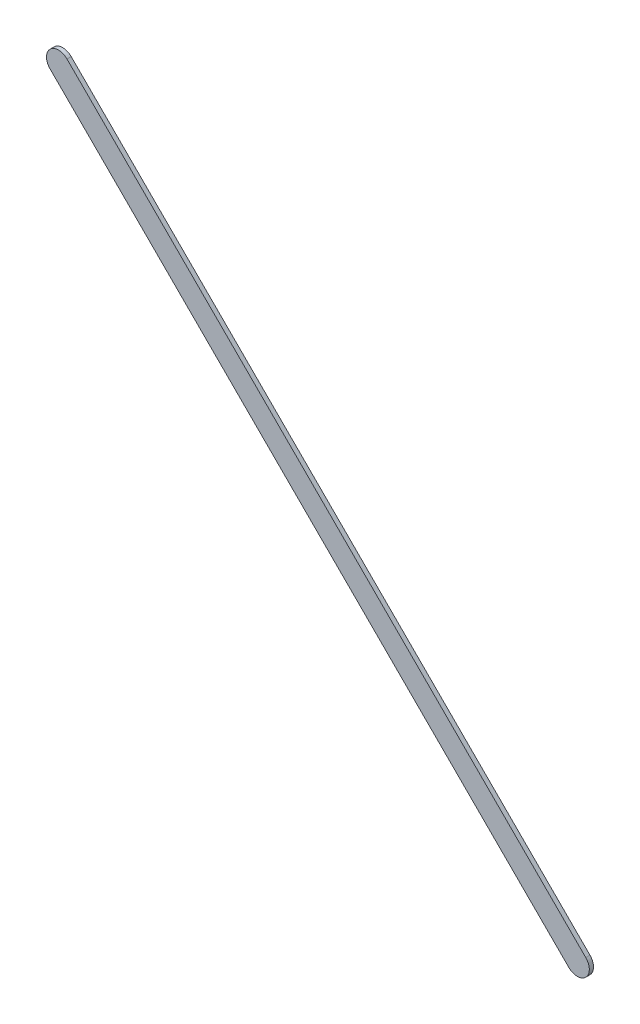
ISO-10303-21;
HEADER;
FILE_DESCRIPTION(('STEP AP214'),'2;1');
FILE_NAME('part.step','',(''),(''),'','','');
FILE_SCHEMA(('AUTOMOTIVE_DESIGN { 1 0 10303 214 1 1 1 1 }'));
ENDSEC;
DATA;
#1=APPLICATION_CONTEXT('core data for automotive mechanical design processes');
#2=APPLICATION_PROTOCOL_DEFINITION('international standard','automotive_design',2000,#1);
#3=PRODUCT_CONTEXT('',#1,'mechanical');
#4=PRODUCT('Part','Part','',(#3));
#5=PRODUCT_RELATED_PRODUCT_CATEGORY('part','',(#4));
#6=PRODUCT_DEFINITION_FORMATION('','',#4);
#7=PRODUCT_DEFINITION_CONTEXT('part definition',#1,'design');
#8=PRODUCT_DEFINITION('design','',#6,#7);
#9=PRODUCT_DEFINITION_SHAPE('','',#8);
#10=(LENGTH_UNIT() NAMED_UNIT(*) SI_UNIT(.MILLI.,.METRE.));
#11=(NAMED_UNIT(*) PLANE_ANGLE_UNIT() SI_UNIT($,.RADIAN.));
#12=(NAMED_UNIT(*) SI_UNIT($,.STERADIAN.) SOLID_ANGLE_UNIT());
#13=UNCERTAINTY_MEASURE_WITH_UNIT(LENGTH_MEASURE(1.E-05),#10,'distance_accuracy_value','');
#14=(GEOMETRIC_REPRESENTATION_CONTEXT(3) GLOBAL_UNCERTAINTY_ASSIGNED_CONTEXT((#13)) GLOBAL_UNIT_ASSIGNED_CONTEXT((#10,
#11,#12)) REPRESENTATION_CONTEXT('',''));
#15=CARTESIAN_POINT('',(0.,0.,0.));
#16=DIRECTION('',(0.,0.,1.));
#17=DIRECTION('',(1.,0.,0.));
#18=AXIS2_PLACEMENT_3D('',#15,#16,#17);
#19=CARTESIAN_POINT('',(85.104289,-119.173652,1.635));
#20=DIRECTION('',(0.,0.,1.));
#21=DIRECTION('',(1.,0.,0.));
#22=AXIS2_PLACEMENT_3D('',#19,#20,#21);
#23=PLANE('',#22);
#24=DIRECTION('',(0.707106781186548,-0.707106781186548,0.));
#25=VECTOR('',#24,1.);
#26=CARTESIAN_POINT('',(85.104289,-119.173652,1.635));
#27=LINE('',#26,#25);
#28=CARTESIAN_POINT('',(85.104289,-119.173652,1.635));
#29=VERTEX_POINT('',#28);
#30=CARTESIAN_POINT('',(89.426347,-123.49571,1.635));
#31=VERTEX_POINT('',#30);
#32=EDGE_CURVE('E96',#29,#31,#27,.T.);
#33=ORIENTED_EDGE('',*,*,#32,.T.);
#34=CARTESIAN_POINT('',(89.4970575,-123.4249995,1.635));
#35=DIRECTION('',(0.,0.,1.));
#36=DIRECTION('',(-0.707106781186548,-0.707106781186548,0.));
#37=AXIS2_PLACEMENT_3D('',#34,#35,#36);
#38=CIRCLE('',#37,0.09999974810218);
#39=CARTESIAN_POINT('',(89.567768,-123.354289,1.635));
#40=VERTEX_POINT('',#39);
#41=EDGE_CURVE('E76',#31,#40,#38,.T.);
#42=ORIENTED_EDGE('',*,*,#41,.T.);
#43=DIRECTION('',(-0.707106781186548,0.707106781186548,0.));
#44=VECTOR('',#43,1.);
#45=CARTESIAN_POINT('',(89.567768,-123.354289,1.635));
#46=LINE('',#45,#44);
#47=CARTESIAN_POINT('',(85.24571,-119.032231,1.635));
#48=VERTEX_POINT('',#47);
#49=EDGE_CURVE('E80',#40,#48,#46,.T.);
#50=ORIENTED_EDGE('',*,*,#49,.T.);
#51=CARTESIAN_POINT('',(85.1749995,-119.1029415,1.635));
#52=DIRECTION('',(0.,0.,1.));
#53=DIRECTION('',(0.707106781186548,0.707106781186548,0.));
#54=AXIS2_PLACEMENT_3D('',#51,#52,#53);
#55=CIRCLE('',#54,0.09999974810219);
#56=EDGE_CURVE('E11',#48,#29,#55,.T.);
#57=ORIENTED_EDGE('',*,*,#56,.T.);
#58=EDGE_LOOP('',(#33,#42,#50,#57));
#59=FACE_BOUND('',#58,.T.);
#60=ADVANCED_FACE('F17',(#59),#23,.T.);
#61=CARTESIAN_POINT('',(85.104289,-119.173652,1.6));
#62=DIRECTION('',(0.,0.,1.));
#63=DIRECTION('',(1.,0.,0.));
#64=AXIS2_PLACEMENT_3D('',#61,#62,#63);
#65=PLANE('',#64);
#66=CARTESIAN_POINT('',(85.1749995,-119.1029415,1.6));
#67=DIRECTION('',(0.,0.,1.));
#68=DIRECTION('',(0.707106781186548,0.707106781186548,0.));
#69=AXIS2_PLACEMENT_3D('',#66,#67,#68);
#70=CIRCLE('',#69,0.09999974810219);
#71=CARTESIAN_POINT('',(85.24571,-119.032231,1.6));
#72=VERTEX_POINT('',#71);
#73=CARTESIAN_POINT('',(85.104289,-119.173652,1.6));
#74=VERTEX_POINT('',#73);
#75=EDGE_CURVE('E25',#72,#74,#70,.T.);
#76=ORIENTED_EDGE('',*,*,#75,.F.);
#77=DIRECTION('',(-0.707106781186548,0.707106781186548,0.));
#78=VECTOR('',#77,1.);
#79=CARTESIAN_POINT('',(89.567768,-123.354289,1.6));
#80=LINE('',#79,#78);
#81=CARTESIAN_POINT('',(89.567768,-123.354289,1.6));
#82=VERTEX_POINT('',#81);
#83=EDGE_CURVE('E66',#82,#72,#80,.T.);
#84=ORIENTED_EDGE('',*,*,#83,.F.);
#85=CARTESIAN_POINT('',(89.4970575,-123.4249995,1.6));
#86=DIRECTION('',(0.,0.,1.));
#87=DIRECTION('',(-0.707106781186548,-0.707106781186548,0.));
#88=AXIS2_PLACEMENT_3D('',#85,#86,#87);
#89=CIRCLE('',#88,0.09999974810218);
#90=CARTESIAN_POINT('',(89.426347,-123.49571,1.6));
#91=VERTEX_POINT('',#90);
#92=EDGE_CURVE('E70',#91,#82,#89,.T.);
#93=ORIENTED_EDGE('',*,*,#92,.F.);
#94=DIRECTION('',(0.707106781186548,-0.707106781186548,0.));
#95=VECTOR('',#94,1.);
#96=CARTESIAN_POINT('',(85.104289,-119.173652,1.6));
#97=LINE('',#96,#95);
#98=EDGE_CURVE('E114',#74,#91,#97,.T.);
#99=ORIENTED_EDGE('',*,*,#98,.F.);
#100=EDGE_LOOP('',(#76,#84,#93,#99));
#101=FACE_BOUND('',#100,.T.);
#102=ADVANCED_FACE('F68',(#101),#65,.F.);
#103=CARTESIAN_POINT('',(85.1749995,-119.1029415,1.6));
#104=DIRECTION('',(0.,0.,-1.));
#105=DIRECTION('',(0.707106781186548,0.707106781186548,0.));
#106=AXIS2_PLACEMENT_3D('',#103,#104,#105);
#107=CYLINDRICAL_SURFACE('',#106,0.09999974810219);
#108=ORIENTED_EDGE('',*,*,#75,.T.);
#109=DIRECTION('',(0.,0.,1.));
#110=VECTOR('',#109,1.);
#111=CARTESIAN_POINT('',(85.104289,-119.173652,1.6));
#112=LINE('',#111,#110);
#113=EDGE_CURVE('E90',#74,#29,#112,.T.);
#114=ORIENTED_EDGE('',*,*,#113,.T.);
#115=ORIENTED_EDGE('',*,*,#56,.F.);
#116=DIRECTION('',(0.,0.,1.));
#117=VECTOR('',#116,1.);
#118=CARTESIAN_POINT('',(85.24571,-119.032231,1.6));
#119=LINE('',#118,#117);
#120=EDGE_CURVE('E75',#72,#48,#119,.T.);
#121=ORIENTED_EDGE('',*,*,#120,.F.);
#122=EDGE_LOOP('',(#108,#114,#115,#121));
#123=FACE_BOUND('',#122,.T.);
#124=ADVANCED_FACE('F139',(#123),#107,.T.);
#125=CARTESIAN_POINT('',(89.567768,-123.354289,1.6));
#126=DIRECTION('',(-0.707106781186548,-0.707106781186548,0.));
#127=DIRECTION('',(-0.707106781186548,0.707106781186548,0.));
#128=AXIS2_PLACEMENT_3D('',#125,#126,#127);
#129=PLANE('',#128);
#130=ORIENTED_EDGE('',*,*,#83,.T.);
#131=ORIENTED_EDGE('',*,*,#120,.T.);
#132=ORIENTED_EDGE('',*,*,#49,.F.);
#133=DIRECTION('',(0.,0.,1.));
#134=VECTOR('',#133,1.);
#135=CARTESIAN_POINT('',(89.567768,-123.354289,1.6));
#136=LINE('',#135,#134);
#137=EDGE_CURVE('E78',#82,#40,#136,.T.);
#138=ORIENTED_EDGE('',*,*,#137,.F.);
#139=EDGE_LOOP('',(#130,#131,#132,#138));
#140=FACE_BOUND('',#139,.T.);
#141=ADVANCED_FACE('F79',(#140),#129,.F.);
#142=CARTESIAN_POINT('',(89.4970575,-123.4249995,1.6));
#143=DIRECTION('',(0.,0.,-1.));
#144=DIRECTION('',(-0.707106781186548,-0.707106781186548,0.));
#145=AXIS2_PLACEMENT_3D('',#142,#143,#144);
#146=CYLINDRICAL_SURFACE('',#145,0.09999974810218);
#147=ORIENTED_EDGE('',*,*,#92,.T.);
#148=ORIENTED_EDGE('',*,*,#137,.T.);
#149=ORIENTED_EDGE('',*,*,#41,.F.);
#150=DIRECTION('',(0.,0.,1.));
#151=VECTOR('',#150,1.);
#152=CARTESIAN_POINT('',(89.426347,-123.49571,1.6));
#153=LINE('',#152,#151);
#154=EDGE_CURVE('E87',#91,#31,#153,.T.);
#155=ORIENTED_EDGE('',*,*,#154,.F.);
#156=EDGE_LOOP('',(#147,#148,#149,#155));
#157=FACE_BOUND('',#156,.T.);
#158=ADVANCED_FACE('F85',(#157),#146,.T.);
#159=CARTESIAN_POINT('',(85.104289,-119.173652,1.6));
#160=DIRECTION('',(0.707106781186548,0.707106781186548,0.));
#161=DIRECTION('',(0.,0.,-1.));
#162=AXIS2_PLACEMENT_3D('',#159,#160,#161);
#163=PLANE('',#162);
#164=ORIENTED_EDGE('',*,*,#98,.T.);
#165=ORIENTED_EDGE('',*,*,#154,.T.);
#166=ORIENTED_EDGE('',*,*,#32,.F.);
#167=ORIENTED_EDGE('',*,*,#113,.F.);
#168=EDGE_LOOP('',(#164,#165,#166,#167));
#169=FACE_BOUND('',#168,.T.);
#170=ADVANCED_FACE('F124',(#169),#163,.F.);
#171=CLOSED_SHELL('',(#60,#102,#124,#141,#158,#170));
#172=MANIFOLD_SOLID_BREP('B1',#171);
#173=ADVANCED_BREP_SHAPE_REPRESENTATION('',(#18,#172),#14);
#174=SHAPE_DEFINITION_REPRESENTATION(#9,#173);
ENDSEC;
END-ISO-10303-21;
